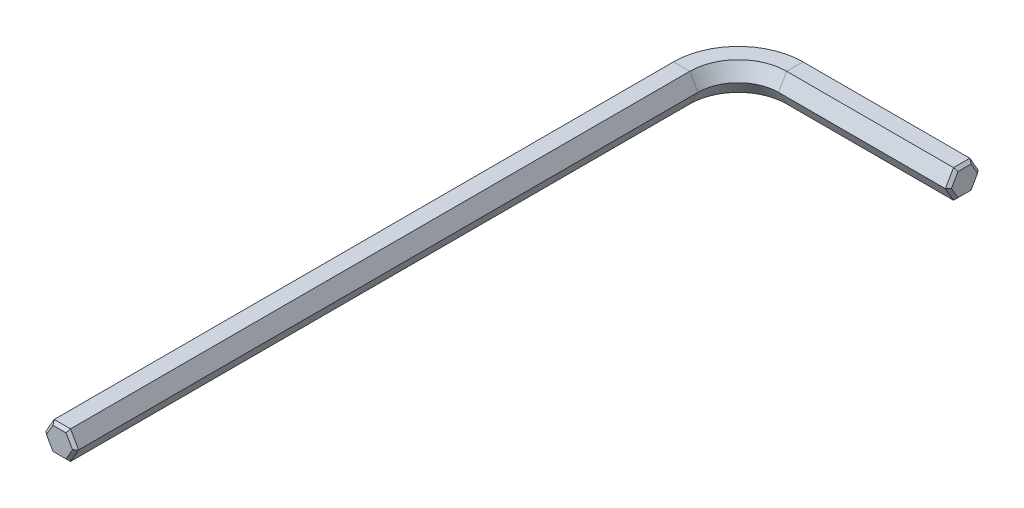
ISO-10303-21;
HEADER;
FILE_DESCRIPTION(('STEP AP214'),'2;1');
FILE_NAME('part.step','',(''),(''),'','','');
FILE_SCHEMA(('AUTOMOTIVE_DESIGN { 1 0 10303 214 1 1 1 1 }'));
ENDSEC;
DATA;
#1=APPLICATION_CONTEXT('core data for automotive mechanical design processes');
#2=APPLICATION_PROTOCOL_DEFINITION('international standard','automotive_design',2000,#1);
#3=PRODUCT_CONTEXT('',#1,'mechanical');
#4=PRODUCT('Part','Part','',(#3));
#5=PRODUCT_RELATED_PRODUCT_CATEGORY('part','',(#4));
#6=PRODUCT_DEFINITION_FORMATION('','',#4);
#7=PRODUCT_DEFINITION_CONTEXT('part definition',#1,'design');
#8=PRODUCT_DEFINITION('design','',#6,#7);
#9=PRODUCT_DEFINITION_SHAPE('','',#8);
#10=(LENGTH_UNIT() NAMED_UNIT(*) SI_UNIT(.MILLI.,.METRE.));
#11=(NAMED_UNIT(*) PLANE_ANGLE_UNIT() SI_UNIT($,.RADIAN.));
#12=(NAMED_UNIT(*) SI_UNIT($,.STERADIAN.) SOLID_ANGLE_UNIT());
#13=UNCERTAINTY_MEASURE_WITH_UNIT(LENGTH_MEASURE(1.E-05),#10,'distance_accuracy_value','');
#14=(GEOMETRIC_REPRESENTATION_CONTEXT(3) GLOBAL_UNCERTAINTY_ASSIGNED_CONTEXT((#13)) GLOBAL_UNIT_ASSIGNED_CONTEXT((#10,
#11,#12)) REPRESENTATION_CONTEXT('',''));
#15=CARTESIAN_POINT('',(0.,0.,0.));
#16=DIRECTION('',(0.,0.,1.));
#17=DIRECTION('',(1.,0.,0.));
#18=AXIS2_PLACEMENT_3D('',#15,#16,#17);
#19=CARTESIAN_POINT('',(0.,0.,0.));
#20=DIRECTION('',(0.,0.,1.));
#21=DIRECTION('',(1.,0.,0.));
#22=AXIS2_PLACEMENT_3D('',#19,#20,#21);
#23=PLANE('',#22);
#24=DIRECTION('',(1.,0.,0.));
#25=VECTOR('',#24,1.);
#26=CARTESIAN_POINT('',(0.721687836487032,-1.00000000000001,0.));
#27=LINE('',#26,#25);
#28=CARTESIAN_POINT('',(-0.577350269189634,-1.00000000000001,0.));
#29=VERTEX_POINT('',#28);
#30=CARTESIAN_POINT('',(0.577350269189634,-1.00000000000001,0.));
#31=VERTEX_POINT('',#30);
#32=EDGE_CURVE('E321',#29,#31,#27,.T.);
#33=ORIENTED_EDGE('',*,*,#32,.T.);
#34=DIRECTION('',(0.5,0.866025403784439,0.));
#35=VECTOR('',#34,1.);
#36=CARTESIAN_POINT('',(1.22686932202797,0.124999999999993,0.));
#37=LINE('',#36,#35);
#38=CARTESIAN_POINT('',(1.15470053837927,0.,0.));
#39=VERTEX_POINT('',#38);
#40=EDGE_CURVE('E323',#31,#39,#37,.T.);
#41=ORIENTED_EDGE('',*,*,#40,.T.);
#42=DIRECTION('',(-0.5,0.866025403784439,0.));
#43=VECTOR('',#42,1.);
#44=CARTESIAN_POINT('',(0.505181485540935,1.12500000000001,0.));
#45=LINE('',#44,#43);
#46=CARTESIAN_POINT('',(0.577350269189634,1.00000000000001,0.));
#47=VERTEX_POINT('',#46);
#48=EDGE_CURVE('E297',#39,#47,#45,.T.);
#49=ORIENTED_EDGE('',*,*,#48,.T.);
#50=DIRECTION('',(-1.,0.,0.));
#51=VECTOR('',#50,1.);
#52=CARTESIAN_POINT('',(-0.721687836487032,1.00000000000001,0.));
#53=LINE('',#52,#51);
#54=CARTESIAN_POINT('',(-0.577350269189634,1.00000000000001,0.));
#55=VERTEX_POINT('',#54);
#56=EDGE_CURVE('E312',#47,#55,#53,.T.);
#57=ORIENTED_EDGE('',*,*,#56,.T.);
#58=DIRECTION('',(-0.5,-0.866025403784439,0.));
#59=VECTOR('',#58,1.);
#60=CARTESIAN_POINT('',(-1.22686932202797,-0.124999999999992,0.));
#61=LINE('',#60,#59);
#62=CARTESIAN_POINT('',(-1.15470053837927,0.,0.));
#63=VERTEX_POINT('',#62);
#64=EDGE_CURVE('E320',#55,#63,#61,.T.);
#65=ORIENTED_EDGE('',*,*,#64,.T.);
#66=DIRECTION('',(0.5,-0.866025403784439,0.));
#67=VECTOR('',#66,1.);
#68=CARTESIAN_POINT('',(-0.505181485540935,-1.12500000000001,0.));
#69=LINE('',#68,#67);
#70=EDGE_CURVE('E317',#63,#29,#69,.T.);
#71=ORIENTED_EDGE('',*,*,#70,.T.);
#72=EDGE_LOOP('',(#33,#41,#49,#57,#65,#71));
#73=FACE_BOUND('',#72,.T.);
#74=ADVANCED_FACE('F41',(#73),#23,.T.);
#75=CARTESIAN_POINT('',(20.,0.,-60.));
#76=DIRECTION('',(-1.,0.,0.));
#77=DIRECTION('',(0.,0.,1.));
#78=AXIS2_PLACEMENT_3D('',#75,#76,#77);
#79=PLANE('',#78);
#80=DIRECTION('',(0.,0.,1.));
#81=VECTOR('',#80,1.);
#82=CARTESIAN_POINT('',(20.,1.,-60.));
#83=LINE('',#82,#81);
#84=CARTESIAN_POINT('',(20.,1.,-60.5773502691896));
#85=VERTEX_POINT('',#84);
#86=CARTESIAN_POINT('',(20.,1.,-59.4226497308104));
#87=VERTEX_POINT('',#86);
#88=EDGE_CURVE('E274',#85,#87,#83,.T.);
#89=ORIENTED_EDGE('',*,*,#88,.T.);
#90=DIRECTION('',(0.,-0.866025403784439,0.5));
#91=VECTOR('',#90,1.);
#92=CARTESIAN_POINT('',(20.,0.499999999999999,-59.1339745962156));
#93=LINE('',#92,#91);
#94=CARTESIAN_POINT('',(20.,0.,-58.8452994616207));
#95=VERTEX_POINT('',#94);
#96=EDGE_CURVE('E284',#87,#95,#93,.T.);
#97=ORIENTED_EDGE('',*,*,#96,.T.);
#98=DIRECTION('',(0.,-0.866025403784439,-0.5));
#99=VECTOR('',#98,1.);
#100=CARTESIAN_POINT('',(20.,-0.499999999999999,-59.1339745962156));
#101=LINE('',#100,#99);
#102=CARTESIAN_POINT('',(20.,-1.,-59.4226497308104));
#103=VERTEX_POINT('',#102);
#104=EDGE_CURVE('E282',#95,#103,#101,.T.);
#105=ORIENTED_EDGE('',*,*,#104,.T.);
#106=DIRECTION('',(0.,0.,-1.));
#107=VECTOR('',#106,1.);
#108=CARTESIAN_POINT('',(20.,-1.,-60.));
#109=LINE('',#108,#107);
#110=CARTESIAN_POINT('',(20.,-1.,-60.5773502691896));
#111=VERTEX_POINT('',#110);
#112=EDGE_CURVE('E281',#103,#111,#109,.T.);
#113=ORIENTED_EDGE('',*,*,#112,.T.);
#114=DIRECTION('',(0.,0.866025403784439,-0.5));
#115=VECTOR('',#114,1.);
#116=CARTESIAN_POINT('',(20.,-0.499999999999998,-60.8660254037844));
#117=LINE('',#116,#115);
#118=CARTESIAN_POINT('',(20.,0.,-61.1547005383792));
#119=VERTEX_POINT('',#118);
#120=EDGE_CURVE('E276',#111,#119,#117,.T.);
#121=ORIENTED_EDGE('',*,*,#120,.T.);
#122=DIRECTION('',(0.,0.866025403784439,0.5));
#123=VECTOR('',#122,1.);
#124=CARTESIAN_POINT('',(20.,0.499999999999999,-60.8660254037844));
#125=LINE('',#124,#123);
#126=EDGE_CURVE('E280',#119,#85,#125,.T.);
#127=ORIENTED_EDGE('',*,*,#126,.T.);
#128=EDGE_LOOP('',(#89,#97,#105,#113,#121,#127));
#129=FACE_BOUND('',#128,.T.);
#130=ADVANCED_FACE('F436',(#129),#79,.F.);
#131=CARTESIAN_POINT('',(1.44337567297406,0.,0.));
#132=DIRECTION('',(-0.866025403784438,-0.5,0.));
#133=DIRECTION('',(0.5,-0.866025403784439,0.));
#134=AXIS2_PLACEMENT_3D('',#131,#132,#133);
#135=PLANE('',#134);
#136=DIRECTION('',(0.,0.,-1.));
#137=VECTOR('',#136,1.);
#138=CARTESIAN_POINT('',(0.721687836487032,1.25,0.));
#139=LINE('',#138,#137);
#140=CARTESIAN_POINT('',(0.721687836487032,1.25,-0.249999999999986));
#141=VERTEX_POINT('',#140);
#142=CARTESIAN_POINT('',(0.721687836487032,1.25,-54.9999999999999));
#143=VERTEX_POINT('',#142);
#144=EDGE_CURVE('E206',#141,#143,#139,.T.);
#145=ORIENTED_EDGE('',*,*,#144,.F.);
#146=DIRECTION('',(0.5,-0.866025403784439,0.));
#147=VECTOR('',#146,1.);
#148=CARTESIAN_POINT('',(1.44337567297406,0.,-0.249999999999986));
#149=LINE('',#148,#147);
#150=CARTESIAN_POINT('',(1.44337567297406,0.,-0.249999999999986));
#151=VERTEX_POINT('',#150);
#152=EDGE_CURVE('E11',#141,#151,#149,.T.);
#153=ORIENTED_EDGE('',*,*,#152,.T.);
#154=DIRECTION('',(0.,0.,-1.));
#155=VECTOR('',#154,1.);
#156=CARTESIAN_POINT('',(1.44337567297406,0.,0.));
#157=LINE('',#156,#155);
#158=CARTESIAN_POINT('',(1.44337567297406,0.,-54.9999999999999));
#159=VERTEX_POINT('',#158);
#160=EDGE_CURVE('E169',#151,#159,#157,.T.);
#161=ORIENTED_EDGE('',*,*,#160,.T.);
#162=DIRECTION('',(-0.5,0.866025403784439,0.));
#163=VECTOR('',#162,1.);
#164=CARTESIAN_POINT('',(1.44337567297406,0.,-54.9999999999999));
#165=LINE('',#164,#163);
#166=EDGE_CURVE('E175',#159,#143,#165,.T.);
#167=ORIENTED_EDGE('',*,*,#166,.T.);
#168=EDGE_LOOP('',(#145,#153,#161,#167));
#169=FACE_BOUND('',#168,.T.);
#170=ADVANCED_FACE('F168',(#169),#135,.F.);
#171=CARTESIAN_POINT('',(0.721687836487032,1.25,0.));
#172=DIRECTION('',(0.,-1.,0.));
#173=DIRECTION('',(0.,0.,-1.));
#174=AXIS2_PLACEMENT_3D('',#171,#172,#173);
#175=PLANE('',#174);
#176=DIRECTION('',(0.,0.,-1.));
#177=VECTOR('',#176,1.);
#178=CARTESIAN_POINT('',(-0.721687836487032,1.25,0.));
#179=LINE('',#178,#177);
#180=CARTESIAN_POINT('',(-0.721687836487032,1.25,-0.249999999999986));
#181=VERTEX_POINT('',#180);
#182=CARTESIAN_POINT('',(-0.721687836487032,1.25,-54.9999999999999));
#183=VERTEX_POINT('',#182);
#184=EDGE_CURVE('E224',#181,#183,#179,.T.);
#185=ORIENTED_EDGE('',*,*,#184,.F.);
#186=DIRECTION('',(1.,0.,0.));
#187=VECTOR('',#186,1.);
#188=CARTESIAN_POINT('',(0.721687836487032,1.25,-0.249999999999986));
#189=LINE('',#188,#187);
#190=EDGE_CURVE('E51',#181,#141,#189,.T.);
#191=ORIENTED_EDGE('',*,*,#190,.T.);
#192=ORIENTED_EDGE('',*,*,#144,.T.);
#193=DIRECTION('',(-1.,0.,0.));
#194=VECTOR('',#193,1.);
#195=CARTESIAN_POINT('',(0.721687836487032,1.25,-54.9999999999999));
#196=LINE('',#195,#194);
#197=EDGE_CURVE('E208',#143,#183,#196,.T.);
#198=ORIENTED_EDGE('',*,*,#197,.T.);
#199=EDGE_LOOP('',(#185,#191,#192,#198));
#200=FACE_BOUND('',#199,.T.);
#201=ADVANCED_FACE('F387',(#200),#175,.F.);
#202=CARTESIAN_POINT('',(-0.721687836487032,1.25,0.));
#203=DIRECTION('',(0.866025403784439,-0.5,0.));
#204=DIRECTION('',(0.5,0.866025403784439,0.));
#205=AXIS2_PLACEMENT_3D('',#202,#203,#204);
#206=PLANE('',#205);
#207=DIRECTION('',(0.,0.,-1.));
#208=VECTOR('',#207,1.);
#209=CARTESIAN_POINT('',(-1.44337567297406,0.,0.));
#210=LINE('',#209,#208);
#211=CARTESIAN_POINT('',(-1.44337567297406,0.,-0.249999999999986));
#212=VERTEX_POINT('',#211);
#213=CARTESIAN_POINT('',(-1.44337567297406,0.,-54.9999999999999));
#214=VERTEX_POINT('',#213);
#215=EDGE_CURVE('E240',#212,#214,#210,.T.);
#216=ORIENTED_EDGE('',*,*,#215,.F.);
#217=DIRECTION('',(0.5,0.866025403784439,0.));
#218=VECTOR('',#217,1.);
#219=CARTESIAN_POINT('',(-0.721687836487032,1.25,-0.249999999999986));
#220=LINE('',#219,#218);
#221=EDGE_CURVE('E67',#212,#181,#220,.T.);
#222=ORIENTED_EDGE('',*,*,#221,.T.);
#223=ORIENTED_EDGE('',*,*,#184,.T.);
#224=DIRECTION('',(-0.5,-0.866025403784439,0.));
#225=VECTOR('',#224,1.);
#226=CARTESIAN_POINT('',(-0.721687836487032,1.25,-54.9999999999999));
#227=LINE('',#226,#225);
#228=EDGE_CURVE('E223',#183,#214,#227,.T.);
#229=ORIENTED_EDGE('',*,*,#228,.T.);
#230=EDGE_LOOP('',(#216,#222,#223,#229));
#231=FACE_BOUND('',#230,.T.);
#232=ADVANCED_FACE('F385',(#231),#206,.F.);
#233=CARTESIAN_POINT('',(-1.44337567297406,0.,0.));
#234=DIRECTION('',(0.866025403784439,0.5,0.));
#235=DIRECTION('',(-0.5,0.866025403784439,0.));
#236=AXIS2_PLACEMENT_3D('',#233,#234,#235);
#237=PLANE('',#236);
#238=DIRECTION('',(0.,0.,-1.));
#239=VECTOR('',#238,1.);
#240=CARTESIAN_POINT('',(-0.721687836487032,-1.25,0.));
#241=LINE('',#240,#239);
#242=CARTESIAN_POINT('',(-0.721687836487032,-1.25,-0.249999999999986));
#243=VERTEX_POINT('',#242);
#244=CARTESIAN_POINT('',(-0.721687836487032,-1.25,-54.9999999999999));
#245=VERTEX_POINT('',#244);
#246=EDGE_CURVE('E253',#243,#245,#241,.T.);
#247=ORIENTED_EDGE('',*,*,#246,.F.);
#248=DIRECTION('',(-0.5,0.866025403784439,0.));
#249=VECTOR('',#248,1.);
#250=CARTESIAN_POINT('',(-1.44337567297406,0.,-0.249999999999986));
#251=LINE('',#250,#249);
#252=EDGE_CURVE('E329',#243,#212,#251,.T.);
#253=ORIENTED_EDGE('',*,*,#252,.T.);
#254=ORIENTED_EDGE('',*,*,#215,.T.);
#255=DIRECTION('',(0.5,-0.866025403784439,0.));
#256=VECTOR('',#255,1.);
#257=CARTESIAN_POINT('',(-1.44337567297406,0.,-54.9999999999999));
#258=LINE('',#257,#256);
#259=EDGE_CURVE('E239',#214,#245,#258,.T.);
#260=ORIENTED_EDGE('',*,*,#259,.T.);
#261=EDGE_LOOP('',(#247,#253,#254,#260));
#262=FACE_BOUND('',#261,.T.);
#263=ADVANCED_FACE('F380',(#262),#237,.F.);
#264=CARTESIAN_POINT('',(-0.721687836487032,-1.25,0.));
#265=DIRECTION('',(0.,1.,0.));
#266=DIRECTION('',(-1.,0.,0.));
#267=AXIS2_PLACEMENT_3D('',#264,#265,#266);
#268=PLANE('',#267);
#269=DIRECTION('',(0.,0.,-1.));
#270=VECTOR('',#269,1.);
#271=CARTESIAN_POINT('',(0.721687836487032,-1.25,0.));
#272=LINE('',#271,#270);
#273=CARTESIAN_POINT('',(0.721687836487032,-1.25,-0.249999999999986));
#274=VERTEX_POINT('',#273);
#275=CARTESIAN_POINT('',(0.721687836487032,-1.25,-54.9999999999999));
#276=VERTEX_POINT('',#275);
#277=EDGE_CURVE('E196',#274,#276,#272,.T.);
#278=ORIENTED_EDGE('',*,*,#277,.F.);
#279=DIRECTION('',(-1.,0.,0.));
#280=VECTOR('',#279,1.);
#281=CARTESIAN_POINT('',(-0.721687836487032,-1.25,-0.249999999999986));
#282=LINE('',#281,#280);
#283=EDGE_CURVE('E327',#274,#243,#282,.T.);
#284=ORIENTED_EDGE('',*,*,#283,.T.);
#285=ORIENTED_EDGE('',*,*,#246,.T.);
#286=DIRECTION('',(1.,0.,0.));
#287=VECTOR('',#286,1.);
#288=CARTESIAN_POINT('',(-0.721687836487032,-1.25,-54.9999999999999));
#289=LINE('',#288,#287);
#290=EDGE_CURVE('E251',#245,#276,#289,.T.);
#291=ORIENTED_EDGE('',*,*,#290,.T.);
#292=EDGE_LOOP('',(#278,#284,#285,#291));
#293=FACE_BOUND('',#292,.T.);
#294=ADVANCED_FACE('F369',(#293),#268,.F.);
#295=CARTESIAN_POINT('',(0.721687836487032,-1.25,0.));
#296=DIRECTION('',(-0.866025403784438,0.5,0.));
#297=DIRECTION('',(-0.5,-0.866025403784439,0.));
#298=AXIS2_PLACEMENT_3D('',#295,#296,#297);
#299=PLANE('',#298);
#300=ORIENTED_EDGE('',*,*,#160,.F.);
#301=DIRECTION('',(-0.5,-0.866025403784439,0.));
#302=VECTOR('',#301,1.);
#303=CARTESIAN_POINT('',(0.721687836487032,-1.25,-0.249999999999986));
#304=LINE('',#303,#302);
#305=EDGE_CURVE('E326',#151,#274,#304,.T.);
#306=ORIENTED_EDGE('',*,*,#305,.T.);
#307=ORIENTED_EDGE('',*,*,#277,.T.);
#308=DIRECTION('',(0.5,0.866025403784439,0.));
#309=VECTOR('',#308,1.);
#310=CARTESIAN_POINT('',(0.721687836487032,-1.25,-54.9999999999999));
#311=LINE('',#310,#309);
#312=EDGE_CURVE('E190',#276,#159,#311,.T.);
#313=ORIENTED_EDGE('',*,*,#312,.T.);
#314=EDGE_LOOP('',(#300,#306,#307,#313));
#315=FACE_BOUND('',#314,.T.);
#316=ADVANCED_FACE('F198',(#315),#299,.F.);
#317=CARTESIAN_POINT('',(5.,0.,-55.));
#318=DIRECTION('',(0.,1.,0.));
#319=DIRECTION('',(0.,0.,1.));
#320=AXIS2_PLACEMENT_3D('',#317,#318,#319);
#321=CONICAL_SURFACE('',#320,3.55662432702593,0.523598775598299);
#322=CARTESIAN_POINT('',(5.,1.25,-55.));
#323=DIRECTION('',(0.,-1.,0.));
#324=DIRECTION('',(-1.,0.,0.));
#325=AXIS2_PLACEMENT_3D('',#322,#323,#324);
#326=CIRCLE('',#325,4.27831216351297);
#327=CARTESIAN_POINT('',(5.,1.25,-59.278312163513));
#328=VERTEX_POINT('',#327);
#329=EDGE_CURVE('E204',#143,#328,#326,.T.);
#330=ORIENTED_EDGE('',*,*,#329,.F.);
#331=ORIENTED_EDGE('',*,*,#166,.F.);
#332=CARTESIAN_POINT('',(5.,0.,-55.));
#333=DIRECTION('',(0.,-1.,0.));
#334=DIRECTION('',(-1.,0.,0.));
#335=AXIS2_PLACEMENT_3D('',#332,#333,#334);
#336=CIRCLE('',#335,3.55662432702593);
#337=CARTESIAN_POINT('',(5.,0.,-58.5566243270259));
#338=VERTEX_POINT('',#337);
#339=EDGE_CURVE('E184',#159,#338,#336,.T.);
#340=ORIENTED_EDGE('',*,*,#339,.T.);
#341=DIRECTION('',(0.,0.866025403784439,-0.5));
#342=VECTOR('',#341,1.);
#343=CARTESIAN_POINT('',(5.,0.,-58.5566243270259));
#344=LINE('',#343,#342);
#345=EDGE_CURVE('E191',#338,#328,#344,.T.);
#346=ORIENTED_EDGE('',*,*,#345,.T.);
#347=EDGE_LOOP('',(#330,#331,#340,#346));
#348=FACE_BOUND('',#347,.T.);
#349=ADVANCED_FACE('F205',(#348),#321,.F.);
#350=CARTESIAN_POINT('',(0.721687836487033,1.25,-55.));
#351=DIRECTION('',(0.,-1.,0.));
#352=DIRECTION('',(0.,0.,-1.));
#353=AXIS2_PLACEMENT_3D('',#350,#351,#352);
#354=PLANE('',#353);
#355=CARTESIAN_POINT('',(5.,1.25,-55.));
#356=DIRECTION('',(0.,-1.,0.));
#357=DIRECTION('',(-1.,0.,0.));
#358=AXIS2_PLACEMENT_3D('',#355,#356,#357);
#359=CIRCLE('',#358,5.72168783648703);
#360=CARTESIAN_POINT('',(5.,1.25,-60.721687836487));
#361=VERTEX_POINT('',#360);
#362=EDGE_CURVE('E227',#183,#361,#359,.T.);
#363=ORIENTED_EDGE('',*,*,#362,.F.);
#364=ORIENTED_EDGE('',*,*,#197,.F.);
#365=ORIENTED_EDGE('',*,*,#329,.T.);
#366=DIRECTION('',(0.,0.,-1.));
#367=VECTOR('',#366,1.);
#368=CARTESIAN_POINT('',(5.,1.25,-59.278312163513));
#369=LINE('',#368,#367);
#370=EDGE_CURVE('E215',#328,#361,#369,.T.);
#371=ORIENTED_EDGE('',*,*,#370,.T.);
#372=EDGE_LOOP('',(#363,#364,#365,#371));
#373=FACE_BOUND('',#372,.T.);
#374=ADVANCED_FACE('F389',(#373),#354,.F.);
#375=CARTESIAN_POINT('',(5.,1.25,-55.));
#376=DIRECTION('',(0.,-1.,0.));
#377=DIRECTION('',(0.,0.,-1.));
#378=AXIS2_PLACEMENT_3D('',#375,#376,#377);
#379=CONICAL_SURFACE('',#378,5.72168783648703,0.523598775598298);
#380=CARTESIAN_POINT('',(5.,0.,-55.));
#381=DIRECTION('',(0.,-1.,0.));
#382=DIRECTION('',(-1.,0.,0.));
#383=AXIS2_PLACEMENT_3D('',#380,#381,#382);
#384=CIRCLE('',#383,6.44337567297406);
#385=CARTESIAN_POINT('',(5.,0.,-61.4433756729741));
#386=VERTEX_POINT('',#385);
#387=EDGE_CURVE('E245',#214,#386,#384,.T.);
#388=ORIENTED_EDGE('',*,*,#387,.F.);
#389=ORIENTED_EDGE('',*,*,#228,.F.);
#390=ORIENTED_EDGE('',*,*,#362,.T.);
#391=DIRECTION('',(0.,-0.866025403784439,-0.5));
#392=VECTOR('',#391,1.);
#393=CARTESIAN_POINT('',(5.,1.25,-60.721687836487));
#394=LINE('',#393,#392);
#395=EDGE_CURVE('E232',#361,#386,#394,.T.);
#396=ORIENTED_EDGE('',*,*,#395,.T.);
#397=EDGE_LOOP('',(#388,#389,#390,#396));
#398=FACE_BOUND('',#397,.T.);
#399=ADVANCED_FACE('F384',(#398),#379,.T.);
#400=CARTESIAN_POINT('',(5.,0.,-55.));
#401=DIRECTION('',(0.,1.,0.));
#402=DIRECTION('',(0.,0.,1.));
#403=AXIS2_PLACEMENT_3D('',#400,#401,#402);
#404=CONICAL_SURFACE('',#403,6.44337567297406,0.523598775598298);
#405=CARTESIAN_POINT('',(5.,-1.25,-55.));
#406=DIRECTION('',(0.,-1.,0.));
#407=DIRECTION('',(-1.,0.,0.));
#408=AXIS2_PLACEMENT_3D('',#405,#406,#407);
#409=CIRCLE('',#408,5.72168783648703);
#410=CARTESIAN_POINT('',(5.,-1.25,-60.721687836487));
#411=VERTEX_POINT('',#410);
#412=EDGE_CURVE('E258',#245,#411,#409,.T.);
#413=ORIENTED_EDGE('',*,*,#412,.F.);
#414=ORIENTED_EDGE('',*,*,#259,.F.);
#415=ORIENTED_EDGE('',*,*,#387,.T.);
#416=DIRECTION('',(0.,-0.866025403784439,0.5));
#417=VECTOR('',#416,1.);
#418=CARTESIAN_POINT('',(5.,0.,-61.443375672974));
#419=LINE('',#418,#417);
#420=EDGE_CURVE('E244',#386,#411,#419,.T.);
#421=ORIENTED_EDGE('',*,*,#420,.T.);
#422=EDGE_LOOP('',(#413,#414,#415,#421));
#423=FACE_BOUND('',#422,.T.);
#424=ADVANCED_FACE('F379',(#423),#404,.T.);
#425=CARTESIAN_POINT('',(-0.721687836487031,-1.25,-55.));
#426=DIRECTION('',(0.,1.,0.));
#427=DIRECTION('',(0.,0.,1.));
#428=AXIS2_PLACEMENT_3D('',#425,#426,#427);
#429=PLANE('',#428);
#430=CARTESIAN_POINT('',(5.,-1.25,-55.));
#431=DIRECTION('',(0.,-1.,0.));
#432=DIRECTION('',(-1.,0.,0.));
#433=AXIS2_PLACEMENT_3D('',#430,#431,#432);
#434=CIRCLE('',#433,4.27831216351297);
#435=CARTESIAN_POINT('',(5.,-1.25,-59.278312163513));
#436=VERTEX_POINT('',#435);
#437=EDGE_CURVE('E270',#276,#436,#434,.T.);
#438=ORIENTED_EDGE('',*,*,#437,.F.);
#439=ORIENTED_EDGE('',*,*,#290,.F.);
#440=ORIENTED_EDGE('',*,*,#412,.T.);
#441=DIRECTION('',(0.,0.,1.));
#442=VECTOR('',#441,1.);
#443=CARTESIAN_POINT('',(5.,-1.25,-60.721687836487));
#444=LINE('',#443,#442);
#445=EDGE_CURVE('E259',#411,#436,#444,.T.);
#446=ORIENTED_EDGE('',*,*,#445,.T.);
#447=EDGE_LOOP('',(#438,#439,#440,#446));
#448=FACE_BOUND('',#447,.T.);
#449=ADVANCED_FACE('F372',(#448),#429,.F.);
#450=CARTESIAN_POINT('',(5.,-1.25,-55.));
#451=DIRECTION('',(0.,-1.,0.));
#452=DIRECTION('',(0.,0.,-1.));
#453=AXIS2_PLACEMENT_3D('',#450,#451,#452);
#454=CONICAL_SURFACE('',#453,4.27831216351297,0.523598775598299);
#455=DIRECTION('',(0.,0.866025403784439,0.5));
#456=VECTOR('',#455,1.);
#457=CARTESIAN_POINT('',(5.,-1.25,-59.278312163513));
#458=LINE('',#457,#456);
#459=EDGE_CURVE('E189',#436,#338,#458,.T.);
#460=ORIENTED_EDGE('',*,*,#459,.T.);
#461=ORIENTED_EDGE('',*,*,#339,.F.);
#462=ORIENTED_EDGE('',*,*,#312,.F.);
#463=ORIENTED_EDGE('',*,*,#437,.T.);
#464=EDGE_LOOP('',(#460,#461,#462,#463));
#465=FACE_BOUND('',#464,.T.);
#466=ADVANCED_FACE('F183',(#465),#454,.F.);
#467=CARTESIAN_POINT('',(5.,0.,-58.5566243270259));
#468=DIRECTION('',(0.,-0.5,-0.866025403784439));
#469=DIRECTION('',(0.,0.866025403784439,-0.5));
#470=AXIS2_PLACEMENT_3D('',#467,#468,#469);
#471=PLANE('',#470);
#472=DIRECTION('',(1.,0.,0.));
#473=VECTOR('',#472,1.);
#474=CARTESIAN_POINT('',(5.,0.,-58.5566243270259));
#475=LINE('',#474,#473);
#476=CARTESIAN_POINT('',(19.75,0.,-58.5566243270259));
#477=VERTEX_POINT('',#476);
#478=EDGE_CURVE('E217',#338,#477,#475,.T.);
#479=ORIENTED_EDGE('',*,*,#478,.T.);
#480=DIRECTION('',(0.,0.866025403784439,-0.5));
#481=VECTOR('',#480,1.);
#482=CARTESIAN_POINT('',(19.75,0.,-58.5566243270259));
#483=LINE('',#482,#481);
#484=CARTESIAN_POINT('',(19.75,1.25,-59.278312163513));
#485=VERTEX_POINT('',#484);
#486=EDGE_CURVE('E269',#477,#485,#483,.T.);
#487=ORIENTED_EDGE('',*,*,#486,.T.);
#488=DIRECTION('',(1.,0.,0.));
#489=VECTOR('',#488,1.);
#490=CARTESIAN_POINT('',(5.,1.25,-59.278312163513));
#491=LINE('',#490,#489);
#492=EDGE_CURVE('E212',#328,#485,#491,.T.);
#493=ORIENTED_EDGE('',*,*,#492,.F.);
#494=ORIENTED_EDGE('',*,*,#345,.F.);
#495=EDGE_LOOP('',(#479,#487,#493,#494));
#496=FACE_BOUND('',#495,.T.);
#497=ADVANCED_FACE('F414',(#496),#471,.F.);
#498=CARTESIAN_POINT('',(5.,1.25,-59.278312163513));
#499=DIRECTION('',(0.,-1.,0.));
#500=DIRECTION('',(0.,0.,-1.));
#501=AXIS2_PLACEMENT_3D('',#498,#499,#500);
#502=PLANE('',#501);
#503=ORIENTED_EDGE('',*,*,#492,.T.);
#504=DIRECTION('',(0.,0.,-1.));
#505=VECTOR('',#504,1.);
#506=CARTESIAN_POINT('',(19.75,1.25,-59.278312163513));
#507=LINE('',#506,#505);
#508=CARTESIAN_POINT('',(19.75,1.25,-60.721687836487));
#509=VERTEX_POINT('',#508);
#510=EDGE_CURVE('E296',#485,#509,#507,.T.);
#511=ORIENTED_EDGE('',*,*,#510,.T.);
#512=DIRECTION('',(1.,0.,0.));
#513=VECTOR('',#512,1.);
#514=CARTESIAN_POINT('',(5.,1.25,-60.721687836487));
#515=LINE('',#514,#513);
#516=EDGE_CURVE('E220',#361,#509,#515,.T.);
#517=ORIENTED_EDGE('',*,*,#516,.F.);
#518=ORIENTED_EDGE('',*,*,#370,.F.);
#519=EDGE_LOOP('',(#503,#511,#517,#518));
#520=FACE_BOUND('',#519,.T.);
#521=ADVANCED_FACE('F391',(#520),#502,.F.);
#522=CARTESIAN_POINT('',(5.,1.25,-60.721687836487));
#523=DIRECTION('',(0.,-0.5,0.866025403784439));
#524=DIRECTION('',(0.,-0.866025403784439,-0.5));
#525=AXIS2_PLACEMENT_3D('',#522,#523,#524);
#526=PLANE('',#525);
#527=ORIENTED_EDGE('',*,*,#516,.T.);
#528=DIRECTION('',(0.,-0.866025403784439,-0.5));
#529=VECTOR('',#528,1.);
#530=CARTESIAN_POINT('',(19.75,1.25,-60.721687836487));
#531=LINE('',#530,#529);
#532=CARTESIAN_POINT('',(19.75,0.,-61.443375672974));
#533=VERTEX_POINT('',#532);
#534=EDGE_CURVE('E294',#509,#533,#531,.T.);
#535=ORIENTED_EDGE('',*,*,#534,.T.);
#536=DIRECTION('',(1.,0.,0.));
#537=VECTOR('',#536,1.);
#538=CARTESIAN_POINT('',(5.,0.,-61.443375672974));
#539=LINE('',#538,#537);
#540=EDGE_CURVE('E231',#386,#533,#539,.T.);
#541=ORIENTED_EDGE('',*,*,#540,.F.);
#542=ORIENTED_EDGE('',*,*,#395,.F.);
#543=EDGE_LOOP('',(#527,#535,#541,#542));
#544=FACE_BOUND('',#543,.T.);
#545=ADVANCED_FACE('F397',(#544),#526,.F.);
#546=CARTESIAN_POINT('',(5.,0.,-61.443375672974));
#547=DIRECTION('',(0.,0.5,0.866025403784439));
#548=DIRECTION('',(0.,-0.866025403784439,0.5));
#549=AXIS2_PLACEMENT_3D('',#546,#547,#548);
#550=PLANE('',#549);
#551=ORIENTED_EDGE('',*,*,#540,.T.);
#552=DIRECTION('',(0.,-0.866025403784439,0.5));
#553=VECTOR('',#552,1.);
#554=CARTESIAN_POINT('',(19.75,0.,-61.443375672974));
#555=LINE('',#554,#553);
#556=CARTESIAN_POINT('',(19.75,-1.25,-60.721687836487));
#557=VERTEX_POINT('',#556);
#558=EDGE_CURVE('E295',#533,#557,#555,.T.);
#559=ORIENTED_EDGE('',*,*,#558,.T.);
#560=DIRECTION('',(1.,0.,0.));
#561=VECTOR('',#560,1.);
#562=CARTESIAN_POINT('',(5.,-1.25,-60.721687836487));
#563=LINE('',#562,#561);
#564=EDGE_CURVE('E250',#411,#557,#563,.T.);
#565=ORIENTED_EDGE('',*,*,#564,.F.);
#566=ORIENTED_EDGE('',*,*,#420,.F.);
#567=EDGE_LOOP('',(#551,#559,#565,#566));
#568=FACE_BOUND('',#567,.T.);
#569=ADVANCED_FACE('F398',(#568),#550,.F.);
#570=CARTESIAN_POINT('',(5.,-1.25,-60.721687836487));
#571=DIRECTION('',(0.,1.,0.));
#572=DIRECTION('',(0.,0.,1.));
#573=AXIS2_PLACEMENT_3D('',#570,#571,#572);
#574=PLANE('',#573);
#575=ORIENTED_EDGE('',*,*,#564,.T.);
#576=DIRECTION('',(0.,0.,1.));
#577=VECTOR('',#576,1.);
#578=CARTESIAN_POINT('',(19.75,-1.25,-60.721687836487));
#579=LINE('',#578,#577);
#580=CARTESIAN_POINT('',(19.75,-1.25,-59.278312163513));
#581=VERTEX_POINT('',#580);
#582=EDGE_CURVE('E288',#557,#581,#579,.T.);
#583=ORIENTED_EDGE('',*,*,#582,.T.);
#584=DIRECTION('',(1.,0.,0.));
#585=VECTOR('',#584,1.);
#586=CARTESIAN_POINT('',(5.,-1.25,-59.278312163513));
#587=LINE('',#586,#585);
#588=EDGE_CURVE('E265',#436,#581,#587,.T.);
#589=ORIENTED_EDGE('',*,*,#588,.F.);
#590=ORIENTED_EDGE('',*,*,#445,.F.);
#591=EDGE_LOOP('',(#575,#583,#589,#590));
#592=FACE_BOUND('',#591,.T.);
#593=ADVANCED_FACE('F404',(#592),#574,.F.);
#594=CARTESIAN_POINT('',(5.,-1.25,-59.278312163513));
#595=DIRECTION('',(0.,0.5,-0.866025403784439));
#596=DIRECTION('',(0.,0.866025403784439,0.5));
#597=AXIS2_PLACEMENT_3D('',#594,#595,#596);
#598=PLANE('',#597);
#599=ORIENTED_EDGE('',*,*,#588,.T.);
#600=DIRECTION('',(0.,0.866025403784439,0.5));
#601=VECTOR('',#600,1.);
#602=CARTESIAN_POINT('',(19.75,-1.25,-59.278312163513));
#603=LINE('',#602,#601);
#604=EDGE_CURVE('E290',#581,#477,#603,.T.);
#605=ORIENTED_EDGE('',*,*,#604,.T.);
#606=ORIENTED_EDGE('',*,*,#478,.F.);
#607=ORIENTED_EDGE('',*,*,#459,.F.);
#608=EDGE_LOOP('',(#599,#605,#606,#607));
#609=FACE_BOUND('',#608,.T.);
#610=ADVANCED_FACE('F407',(#609),#598,.F.);
#611=CARTESIAN_POINT('',(19.75,0.,-61.443375672974));
#612=DIRECTION('',(-0.707106781186549,0.353553390593273,0.612372435695793));
#613=DIRECTION('',(0.,-0.866025403784439,0.5));
#614=AXIS2_PLACEMENT_3D('',#611,#612,#613);
#615=PLANE('',#614);
#616=DIRECTION('',(-0.654653670707975,0.,-0.755928946018456));
#617=VECTOR('',#616,1.);
#618=CARTESIAN_POINT('',(20.1071428571429,0.,-61.0309826235529));
#619=LINE('',#618,#617);
#620=EDGE_CURVE('E310',#119,#533,#619,.T.);
#621=ORIENTED_EDGE('',*,*,#620,.F.);
#622=ORIENTED_EDGE('',*,*,#120,.F.);
#623=DIRECTION('',(-0.654653670707976,-0.654653670707976,-0.37796447300923));
#624=VECTOR('',#623,1.);
#625=CARTESIAN_POINT('',(20.1071428571429,-0.892857142857145,-60.5154913117764));
#626=LINE('',#625,#624);
#627=EDGE_CURVE('E180',#557,#111,#626,.F.);
#628=ORIENTED_EDGE('',*,*,#627,.F.);
#629=ORIENTED_EDGE('',*,*,#558,.F.);
#630=EDGE_LOOP('',(#621,#622,#628,#629));
#631=FACE_BOUND('',#630,.T.);
#632=ADVANCED_FACE('F431',(#631),#615,.F.);
#633=CARTESIAN_POINT('',(19.75,-1.25,-60.721687836487));
#634=DIRECTION('',(-0.707106781186547,0.707106781186547,0.));
#635=DIRECTION('',(0.,0.,1.));
#636=AXIS2_PLACEMENT_3D('',#633,#634,#635);
#637=PLANE('',#636);
#638=ORIENTED_EDGE('',*,*,#627,.T.);
#639=ORIENTED_EDGE('',*,*,#112,.F.);
#640=DIRECTION('',(-0.654653670707976,-0.654653670707976,0.377964473009232));
#641=VECTOR('',#640,1.);
#642=CARTESIAN_POINT('',(20.1071428571429,-0.89285714285714,-59.4845086882235));
#643=LINE('',#642,#641);
#644=EDGE_CURVE('E308',#581,#103,#643,.F.);
#645=ORIENTED_EDGE('',*,*,#644,.F.);
#646=ORIENTED_EDGE('',*,*,#582,.F.);
#647=EDGE_LOOP('',(#638,#639,#645,#646));
#648=FACE_BOUND('',#647,.T.);
#649=ADVANCED_FACE('F432',(#648),#637,.F.);
#650=CARTESIAN_POINT('',(19.75,1.25,-60.721687836487));
#651=DIRECTION('',(-0.70710678118655,-0.353553390593273,0.612372435695792));
#652=DIRECTION('',(0.,-0.866025403784439,-0.5));
#653=AXIS2_PLACEMENT_3D('',#650,#651,#652);
#654=PLANE('',#653);
#655=ORIENTED_EDGE('',*,*,#620,.T.);
#656=ORIENTED_EDGE('',*,*,#534,.F.);
#657=DIRECTION('',(-0.654653670707976,0.654653670707976,-0.377964473009232));
#658=VECTOR('',#657,1.);
#659=CARTESIAN_POINT('',(20.1071428571429,0.89285714285714,-60.5154913117764));
#660=LINE('',#659,#658);
#661=EDGE_CURVE('E305',#85,#509,#660,.T.);
#662=ORIENTED_EDGE('',*,*,#661,.F.);
#663=ORIENTED_EDGE('',*,*,#126,.F.);
#664=EDGE_LOOP('',(#655,#656,#662,#663));
#665=FACE_BOUND('',#664,.T.);
#666=ADVANCED_FACE('F430',(#665),#654,.F.);
#667=CARTESIAN_POINT('',(19.75,-1.25,-59.278312163513));
#668=DIRECTION('',(-0.70710678118655,0.353553390593273,-0.612372435695792));
#669=DIRECTION('',(0.,0.866025403784439,0.5));
#670=AXIS2_PLACEMENT_3D('',#667,#668,#669);
#671=PLANE('',#670);
#672=ORIENTED_EDGE('',*,*,#644,.T.);
#673=ORIENTED_EDGE('',*,*,#104,.F.);
#674=DIRECTION('',(-0.654653670707975,0.,0.755928946018456));
#675=VECTOR('',#674,1.);
#676=CARTESIAN_POINT('',(20.1071428571429,0.,-58.9690173764471));
#677=LINE('',#676,#675);
#678=EDGE_CURVE('E302',#477,#95,#677,.F.);
#679=ORIENTED_EDGE('',*,*,#678,.F.);
#680=ORIENTED_EDGE('',*,*,#604,.F.);
#681=EDGE_LOOP('',(#672,#673,#679,#680));
#682=FACE_BOUND('',#681,.T.);
#683=ADVANCED_FACE('F418',(#682),#671,.F.);
#684=CARTESIAN_POINT('',(19.75,1.25,-59.278312163513));
#685=DIRECTION('',(-0.707106781186547,-0.707106781186547,0.));
#686=DIRECTION('',(0.,0.,-1.));
#687=AXIS2_PLACEMENT_3D('',#684,#685,#686);
#688=PLANE('',#687);
#689=ORIENTED_EDGE('',*,*,#661,.T.);
#690=ORIENTED_EDGE('',*,*,#510,.F.);
#691=DIRECTION('',(0.654653670707977,-0.654653670707977,-0.377964473009229));
#692=VECTOR('',#691,1.);
#693=CARTESIAN_POINT('',(19.75,1.25,-59.278312163513));
#694=LINE('',#693,#692);
#695=EDGE_CURVE('E298',#87,#485,#694,.F.);
#696=ORIENTED_EDGE('',*,*,#695,.F.);
#697=ORIENTED_EDGE('',*,*,#88,.F.);
#698=EDGE_LOOP('',(#689,#690,#696,#697));
#699=FACE_BOUND('',#698,.T.);
#700=ADVANCED_FACE('F421',(#699),#688,.F.);
#701=CARTESIAN_POINT('',(19.75,0.,-58.5566243270259));
#702=DIRECTION('',(-0.707106781186549,-0.353553390593273,-0.612372435695794));
#703=DIRECTION('',(0.,0.866025403784439,-0.5));
#704=AXIS2_PLACEMENT_3D('',#701,#702,#703);
#705=PLANE('',#704);
#706=ORIENTED_EDGE('',*,*,#678,.T.);
#707=ORIENTED_EDGE('',*,*,#96,.F.);
#708=ORIENTED_EDGE('',*,*,#695,.T.);
#709=ORIENTED_EDGE('',*,*,#486,.F.);
#710=EDGE_LOOP('',(#706,#707,#708,#709));
#711=FACE_BOUND('',#710,.T.);
#712=ADVANCED_FACE('F420',(#711),#705,.F.);
#713=CARTESIAN_POINT('',(-0.866025403784451,0.500000000000007,0.));
#714=DIRECTION('',(-0.612372435695796,0.353553390593274,0.707106781186546));
#715=DIRECTION('',(0.5,0.866025403784439,0.));
#716=AXIS2_PLACEMENT_3D('',#713,#714,#715);
#717=PLANE('',#716);
#718=DIRECTION('',(0.377964473009226,-0.654653670707976,0.654653670707979));
#719=VECTOR('',#718,1.);
#720=CARTESIAN_POINT('',(-0.494871659305401,0.85714285714287,0.142857142857145));
#721=LINE('',#720,#719);
#722=EDGE_CURVE('E345',#181,#55,#721,.T.);
#723=ORIENTED_EDGE('',*,*,#722,.F.);
#724=ORIENTED_EDGE('',*,*,#221,.F.);
#725=DIRECTION('',(0.755928946018453,0.,0.654653670707978));
#726=VECTOR('',#725,1.);
#727=CARTESIAN_POINT('',(-0.989743318610802,0.,0.142857142857145));
#728=LINE('',#727,#726);
#729=EDGE_CURVE('E46',#63,#212,#728,.F.);
#730=ORIENTED_EDGE('',*,*,#729,.F.);
#731=ORIENTED_EDGE('',*,*,#64,.F.);
#732=EDGE_LOOP('',(#723,#724,#730,#731));
#733=FACE_BOUND('',#732,.T.);
#734=ADVANCED_FACE('F42',(#733),#717,.T.);
#735=CARTESIAN_POINT('',(-0.866025403784451,-0.500000000000007,0.));
#736=DIRECTION('',(-0.612372435695795,-0.353553390593274,0.707106781186546));
#737=DIRECTION('',(-0.5,0.866025403784439,0.));
#738=AXIS2_PLACEMENT_3D('',#735,#736,#737);
#739=PLANE('',#738);
#740=ORIENTED_EDGE('',*,*,#729,.T.);
#741=ORIENTED_EDGE('',*,*,#252,.F.);
#742=DIRECTION('',(0.377964473009227,0.654653670707976,0.654653670707978));
#743=VECTOR('',#742,1.);
#744=CARTESIAN_POINT('',(-0.4948716593054,-0.85714285714287,0.142857142857145));
#745=LINE('',#744,#743);
#746=EDGE_CURVE('E342',#29,#243,#745,.F.);
#747=ORIENTED_EDGE('',*,*,#746,.F.);
#748=ORIENTED_EDGE('',*,*,#70,.F.);
#749=EDGE_LOOP('',(#740,#741,#747,#748));
#750=FACE_BOUND('',#749,.T.);
#751=ADVANCED_FACE('F352',(#750),#739,.T.);
#752=CARTESIAN_POINT('',(0.,1.00000000000001,0.));
#753=DIRECTION('',(0.,0.707106781186549,0.707106781186546));
#754=DIRECTION('',(1.,0.,0.));
#755=AXIS2_PLACEMENT_3D('',#752,#753,#754);
#756=PLANE('',#755);
#757=ORIENTED_EDGE('',*,*,#722,.T.);
#758=ORIENTED_EDGE('',*,*,#56,.F.);
#759=DIRECTION('',(-0.377964473009226,-0.654653670707976,0.654653670707978));
#760=VECTOR('',#759,1.);
#761=CARTESIAN_POINT('',(0.494871659305401,0.85714285714287,0.142857142857145));
#762=LINE('',#761,#760);
#763=EDGE_CURVE('E337',#141,#47,#762,.T.);
#764=ORIENTED_EDGE('',*,*,#763,.F.);
#765=ORIENTED_EDGE('',*,*,#190,.F.);
#766=EDGE_LOOP('',(#757,#758,#764,#765));
#767=FACE_BOUND('',#766,.T.);
#768=ADVANCED_FACE('F360',(#767),#756,.T.);
#769=CARTESIAN_POINT('',(0.,-1.00000000000001,0.));
#770=DIRECTION('',(0.,-0.707106781186549,0.707106781186546));
#771=DIRECTION('',(-1.,0.,0.));
#772=AXIS2_PLACEMENT_3D('',#769,#770,#771);
#773=PLANE('',#772);
#774=ORIENTED_EDGE('',*,*,#746,.T.);
#775=ORIENTED_EDGE('',*,*,#283,.F.);
#776=DIRECTION('',(-0.377964473009226,0.654653670707976,0.654653670707978));
#777=VECTOR('',#776,1.);
#778=CARTESIAN_POINT('',(0.494871659305401,-0.85714285714287,0.142857142857145));
#779=LINE('',#778,#777);
#780=EDGE_CURVE('E336',#31,#274,#779,.F.);
#781=ORIENTED_EDGE('',*,*,#780,.F.);
#782=ORIENTED_EDGE('',*,*,#32,.F.);
#783=EDGE_LOOP('',(#774,#775,#781,#782));
#784=FACE_BOUND('',#783,.T.);
#785=ADVANCED_FACE('F617',(#784),#773,.T.);
#786=CARTESIAN_POINT('',(0.866025403784451,0.500000000000007,0.));
#787=DIRECTION('',(0.612372435695796,0.353553390593275,0.707106781186546));
#788=DIRECTION('',(0.5,-0.866025403784439,0.));
#789=AXIS2_PLACEMENT_3D('',#786,#787,#788);
#790=PLANE('',#789);
#791=ORIENTED_EDGE('',*,*,#763,.T.);
#792=ORIENTED_EDGE('',*,*,#48,.F.);
#793=DIRECTION('',(0.755928946018453,0.,-0.654653670707979));
#794=VECTOR('',#793,1.);
#795=CARTESIAN_POINT('',(0.989743318610802,0.,0.142857142857145));
#796=LINE('',#795,#794);
#797=EDGE_CURVE('E331',#151,#39,#796,.F.);
#798=ORIENTED_EDGE('',*,*,#797,.F.);
#799=ORIENTED_EDGE('',*,*,#152,.F.);
#800=EDGE_LOOP('',(#791,#792,#798,#799));
#801=FACE_BOUND('',#800,.T.);
#802=ADVANCED_FACE('F362',(#801),#790,.T.);
#803=CARTESIAN_POINT('',(0.866025403784451,-0.500000000000007,0.));
#804=DIRECTION('',(0.612372435695796,-0.353553390593275,0.707106781186546));
#805=DIRECTION('',(-0.5,-0.866025403784439,0.));
#806=AXIS2_PLACEMENT_3D('',#803,#804,#805);
#807=PLANE('',#806);
#808=ORIENTED_EDGE('',*,*,#780,.T.);
#809=ORIENTED_EDGE('',*,*,#305,.F.);
#810=ORIENTED_EDGE('',*,*,#797,.T.);
#811=ORIENTED_EDGE('',*,*,#40,.F.);
#812=EDGE_LOOP('',(#808,#809,#810,#811));
#813=FACE_BOUND('',#812,.T.);
#814=ADVANCED_FACE('F364',(#813),#807,.T.);
#815=CLOSED_SHELL('',(#74,#130,#170,#201,#232,#263,#294,#316,#349,#374,#399,#424,#449,#466,#497,
#521,#545,#569,#593,#610,#632,#649,#666,#683,#700,#712,#734,#751,#768,#785,#802,#814));
#816=MANIFOLD_SOLID_BREP('B2',#815);
#817=ADVANCED_BREP_SHAPE_REPRESENTATION('',(#18,#816),#14);
#818=SHAPE_DEFINITION_REPRESENTATION(#9,#817);
ENDSEC;
END-ISO-10303-21;
